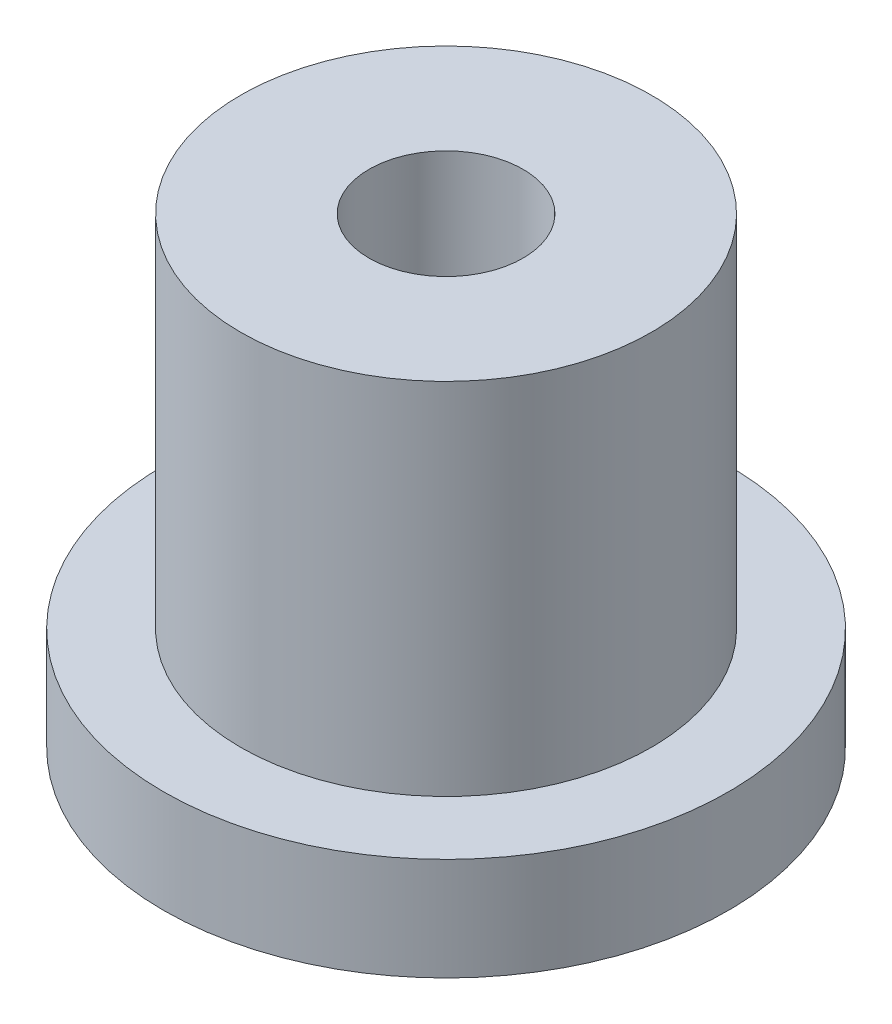
ISO-10303-21;
HEADER;
FILE_DESCRIPTION(('STEP AP214'),'2;1');
FILE_NAME('part.step','',(''),(''),'','','');
FILE_SCHEMA(('AUTOMOTIVE_DESIGN { 1 0 10303 214 1 1 1 1 }'));
ENDSEC;
DATA;
#1=APPLICATION_CONTEXT('core data for automotive mechanical design processes');
#2=APPLICATION_PROTOCOL_DEFINITION('international standard','automotive_design',2000,#1);
#3=PRODUCT_CONTEXT('',#1,'mechanical');
#4=PRODUCT('Part','Part','',(#3));
#5=PRODUCT_RELATED_PRODUCT_CATEGORY('part','',(#4));
#6=PRODUCT_DEFINITION_FORMATION('','',#4);
#7=PRODUCT_DEFINITION_CONTEXT('part definition',#1,'design');
#8=PRODUCT_DEFINITION('design','',#6,#7);
#9=PRODUCT_DEFINITION_SHAPE('','',#8);
#10=(LENGTH_UNIT() NAMED_UNIT(*) SI_UNIT(.MILLI.,.METRE.));
#11=(NAMED_UNIT(*) PLANE_ANGLE_UNIT() SI_UNIT($,.RADIAN.));
#12=(NAMED_UNIT(*) SI_UNIT($,.STERADIAN.) SOLID_ANGLE_UNIT());
#13=UNCERTAINTY_MEASURE_WITH_UNIT(LENGTH_MEASURE(1.E-05),#10,'distance_accuracy_value','');
#14=(GEOMETRIC_REPRESENTATION_CONTEXT(3) GLOBAL_UNCERTAINTY_ASSIGNED_CONTEXT((#13)) GLOBAL_UNIT_ASSIGNED_CONTEXT((#10,
#11,#12)) REPRESENTATION_CONTEXT('',''));
#15=CARTESIAN_POINT('',(0.,0.,0.));
#16=DIRECTION('',(0.,0.,1.));
#17=DIRECTION('',(1.,0.,0.));
#18=AXIS2_PLACEMENT_3D('',#15,#16,#17);
#19=CARTESIAN_POINT('',(0.,2.,0.));
#20=DIRECTION('',(0.,1.,0.));
#21=DIRECTION('',(0.,0.,1.));
#22=AXIS2_PLACEMENT_3D('',#19,#20,#21);
#23=PLANE('',#22);
#24=CARTESIAN_POINT('',(0.,2.,0.));
#25=DIRECTION('',(0.,1.,0.));
#26=DIRECTION('',(0.,0.,1.));
#27=AXIS2_PLACEMENT_3D('',#24,#25,#26);
#28=CIRCLE('',#27,4.);
#29=CARTESIAN_POINT('',(0.,2.,4.));
#30=VERTEX_POINT('',#29);
#31=EDGE_CURVE('E10',#30,#30,#28,.T.);
#32=ORIENTED_EDGE('',*,*,#31,.F.);
#33=EDGE_LOOP('',(#32));
#34=FACE_BOUND('',#33,.T.);
#35=CARTESIAN_POINT('',(0.,2.,0.));
#36=DIRECTION('',(0.,1.,0.));
#37=DIRECTION('',(0.,0.,1.));
#38=AXIS2_PLACEMENT_3D('',#35,#36,#37);
#39=CIRCLE('',#38,5.5);
#40=CARTESIAN_POINT('',(0.,2.,5.5));
#41=VERTEX_POINT('',#40);
#42=EDGE_CURVE('E49',#41,#41,#39,.T.);
#43=ORIENTED_EDGE('',*,*,#42,.T.);
#44=EDGE_LOOP('',(#43));
#45=FACE_BOUND('',#44,.T.);
#46=ADVANCED_FACE('F40',(#34,#45),#23,.T.);
#47=CARTESIAN_POINT('',(0.,0.,0.));
#48=DIRECTION('',(0.,1.,0.));
#49=DIRECTION('',(0.,0.,1.));
#50=AXIS2_PLACEMENT_3D('',#47,#48,#49);
#51=PLANE('',#50);
#52=CARTESIAN_POINT('',(0.,0.,0.));
#53=DIRECTION('',(0.,1.,0.));
#54=DIRECTION('',(0.,0.,1.));
#55=AXIS2_PLACEMENT_3D('',#52,#53,#54);
#56=CIRCLE('',#55,5.5);
#57=CARTESIAN_POINT('',(0.,0.,5.5));
#58=VERTEX_POINT('',#57);
#59=EDGE_CURVE('E44',#58,#58,#56,.T.);
#60=ORIENTED_EDGE('',*,*,#59,.F.);
#61=EDGE_LOOP('',(#60));
#62=FACE_BOUND('',#61,.T.);
#63=CARTESIAN_POINT('',(0.,0.,0.));
#64=DIRECTION('',(0.,1.,0.));
#65=DIRECTION('',(0.,0.,1.));
#66=AXIS2_PLACEMENT_3D('',#63,#64,#65);
#67=CIRCLE('',#66,1.5);
#68=CARTESIAN_POINT('',(0.,0.,1.5));
#69=VERTEX_POINT('',#68);
#70=EDGE_CURVE('E59',#69,#69,#67,.T.);
#71=ORIENTED_EDGE('',*,*,#70,.T.);
#72=EDGE_LOOP('',(#71));
#73=FACE_BOUND('',#72,.T.);
#74=ADVANCED_FACE('F90',(#62,#73),#51,.F.);
#75=CARTESIAN_POINT('',(0.,2.,0.));
#76=DIRECTION('',(0.,-1.,0.));
#77=DIRECTION('',(0.,0.,-1.));
#78=AXIS2_PLACEMENT_3D('',#75,#76,#77);
#79=CYLINDRICAL_SURFACE('',#78,5.5);
#80=ORIENTED_EDGE('',*,*,#42,.F.);
#81=EDGE_LOOP('',(#80));
#82=FACE_BOUND('',#81,.T.);
#83=ORIENTED_EDGE('',*,*,#59,.T.);
#84=EDGE_LOOP('',(#83));
#85=FACE_BOUND('',#84,.T.);
#86=ADVANCED_FACE('F42',(#82,#85),#79,.T.);
#87=CARTESIAN_POINT('',(0.,2.,0.));
#88=DIRECTION('',(0.,-1.,0.));
#89=DIRECTION('',(0.,0.,-1.));
#90=AXIS2_PLACEMENT_3D('',#87,#88,#89);
#91=CYLINDRICAL_SURFACE('',#90,1.5);
#92=ORIENTED_EDGE('',*,*,#70,.F.);
#93=EDGE_LOOP('',(#92));
#94=FACE_BOUND('',#93,.T.);
#95=CARTESIAN_POINT('',(0.,9.,0.));
#96=DIRECTION('',(0.,1.,0.));
#97=DIRECTION('',(0.,0.,1.));
#98=AXIS2_PLACEMENT_3D('',#95,#96,#97);
#99=CIRCLE('',#98,1.5);
#100=CARTESIAN_POINT('',(0.,9.,1.5));
#101=VERTEX_POINT('',#100);
#102=EDGE_CURVE('E68',#101,#101,#99,.T.);
#103=ORIENTED_EDGE('',*,*,#102,.T.);
#104=EDGE_LOOP('',(#103));
#105=FACE_BOUND('',#104,.T.);
#106=ADVANCED_FACE('F75',(#94,#105),#91,.F.);
#107=CARTESIAN_POINT('',(0.,9.,0.));
#108=DIRECTION('',(0.,1.,0.));
#109=DIRECTION('',(0.,0.,1.));
#110=AXIS2_PLACEMENT_3D('',#107,#108,#109);
#111=PLANE('',#110);
#112=CARTESIAN_POINT('',(0.,9.,0.));
#113=DIRECTION('',(0.,1.,0.));
#114=DIRECTION('',(0.,0.,1.));
#115=AXIS2_PLACEMENT_3D('',#112,#113,#114);
#116=CIRCLE('',#115,4.);
#117=CARTESIAN_POINT('',(0.,9.,4.));
#118=VERTEX_POINT('',#117);
#119=EDGE_CURVE('E57',#118,#118,#116,.T.);
#120=ORIENTED_EDGE('',*,*,#119,.T.);
#121=EDGE_LOOP('',(#120));
#122=FACE_BOUND('',#121,.T.);
#123=ORIENTED_EDGE('',*,*,#102,.F.);
#124=EDGE_LOOP('',(#123));
#125=FACE_BOUND('',#124,.T.);
#126=ADVANCED_FACE('F77',(#122,#125),#111,.T.);
#127=CARTESIAN_POINT('',(0.,9.,0.));
#128=DIRECTION('',(0.,-1.,0.));
#129=DIRECTION('',(0.,0.,-1.));
#130=AXIS2_PLACEMENT_3D('',#127,#128,#129);
#131=CYLINDRICAL_SURFACE('',#130,4.);
#132=ORIENTED_EDGE('',*,*,#119,.F.);
#133=EDGE_LOOP('',(#132));
#134=FACE_BOUND('',#133,.T.);
#135=ORIENTED_EDGE('',*,*,#31,.T.);
#136=EDGE_LOOP('',(#135));
#137=FACE_BOUND('',#136,.T.);
#138=ADVANCED_FACE('F79',(#134,#137),#131,.T.);
#139=CLOSED_SHELL('',(#46,#74,#86,#106,#126,#138));
#140=MANIFOLD_SOLID_BREP('B2',#139);
#141=ADVANCED_BREP_SHAPE_REPRESENTATION('',(#18,#140),#14);
#142=SHAPE_DEFINITION_REPRESENTATION(#9,#141);
ENDSEC;
END-ISO-10303-21;
